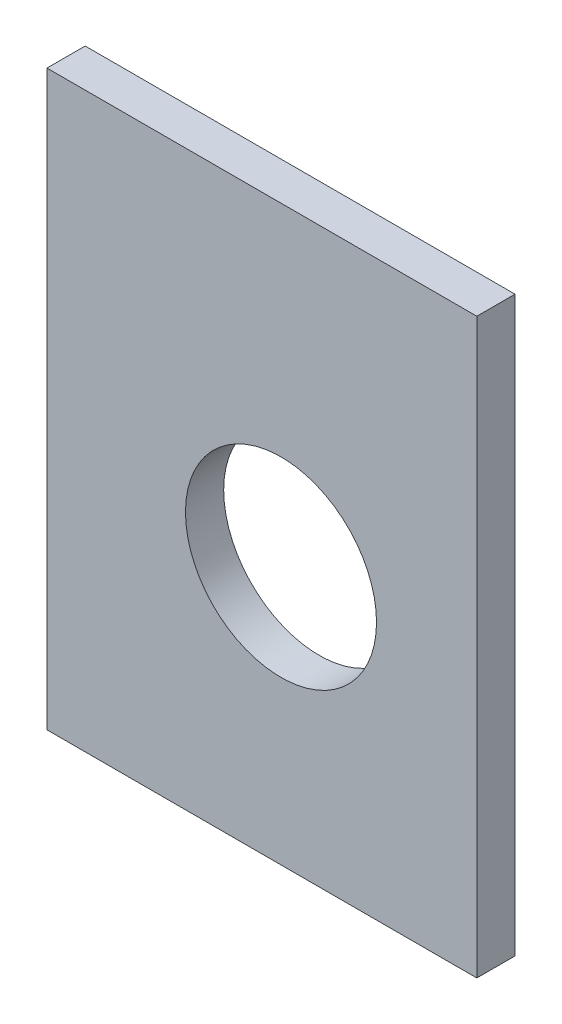
ISO-10303-21;
HEADER;
FILE_DESCRIPTION(('STEP AP214'),'2;1');
FILE_NAME('part.step','',(''),(''),'','','');
FILE_SCHEMA(('AUTOMOTIVE_DESIGN { 1 0 10303 214 1 1 1 1 }'));
ENDSEC;
DATA;
#1=APPLICATION_CONTEXT('core data for automotive mechanical design processes');
#2=APPLICATION_PROTOCOL_DEFINITION('international standard','automotive_design',2000,#1);
#3=PRODUCT_CONTEXT('',#1,'mechanical');
#4=PRODUCT('Part','Part','',(#3));
#5=PRODUCT_RELATED_PRODUCT_CATEGORY('part','',(#4));
#6=PRODUCT_DEFINITION_FORMATION('','',#4);
#7=PRODUCT_DEFINITION_CONTEXT('part definition',#1,'design');
#8=PRODUCT_DEFINITION('design','',#6,#7);
#9=PRODUCT_DEFINITION_SHAPE('','',#8);
#10=(LENGTH_UNIT() NAMED_UNIT(*) SI_UNIT(.MILLI.,.METRE.));
#11=(NAMED_UNIT(*) PLANE_ANGLE_UNIT() SI_UNIT($,.RADIAN.));
#12=(NAMED_UNIT(*) SI_UNIT($,.STERADIAN.) SOLID_ANGLE_UNIT());
#13=UNCERTAINTY_MEASURE_WITH_UNIT(LENGTH_MEASURE(1.E-05),#10,'distance_accuracy_value','');
#14=(GEOMETRIC_REPRESENTATION_CONTEXT(3) GLOBAL_UNCERTAINTY_ASSIGNED_CONTEXT((#13)) GLOBAL_UNIT_ASSIGNED_CONTEXT((#10,
#11,#12)) REPRESENTATION_CONTEXT('',''));
#15=CARTESIAN_POINT('',(0.,0.,0.));
#16=DIRECTION('',(0.,0.,1.));
#17=DIRECTION('',(1.,0.,0.));
#18=AXIS2_PLACEMENT_3D('',#15,#16,#17);
#19=CARTESIAN_POINT('',(0.,0.,4.));
#20=DIRECTION('',(0.,0.,-1.));
#21=DIRECTION('',(-1.,0.,0.));
#22=AXIS2_PLACEMENT_3D('',#19,#20,#21);
#23=PLANE('',#22);
#24=DIRECTION('',(0.,1.,0.));
#25=VECTOR('',#24,1.);
#26=CARTESIAN_POINT('',(22.5,-30.,4.));
#27=LINE('',#26,#25);
#28=CARTESIAN_POINT('',(22.5,-30.,4.));
#29=VERTEX_POINT('',#28);
#30=CARTESIAN_POINT('',(22.5,30.,4.));
#31=VERTEX_POINT('',#30);
#32=EDGE_CURVE('E84',#29,#31,#27,.T.);
#33=ORIENTED_EDGE('',*,*,#32,.T.);
#34=DIRECTION('',(-1.,0.,0.));
#35=VECTOR('',#34,1.);
#36=CARTESIAN_POINT('',(-22.5,30.,4.));
#37=LINE('',#36,#35);
#38=CARTESIAN_POINT('',(-22.5,30.,4.));
#39=VERTEX_POINT('',#38);
#40=EDGE_CURVE('E79',#31,#39,#37,.T.);
#41=ORIENTED_EDGE('',*,*,#40,.T.);
#42=DIRECTION('',(0.,-1.,0.));
#43=VECTOR('',#42,1.);
#44=CARTESIAN_POINT('',(-22.5,-30.,4.));
#45=LINE('',#44,#43);
#46=CARTESIAN_POINT('',(-22.5,-30.,4.));
#47=VERTEX_POINT('',#46);
#48=EDGE_CURVE('E82',#39,#47,#45,.T.);
#49=ORIENTED_EDGE('',*,*,#48,.T.);
#50=DIRECTION('',(1.,0.,0.));
#51=VECTOR('',#50,1.);
#52=CARTESIAN_POINT('',(-22.5,-30.,4.));
#53=LINE('',#52,#51);
#54=EDGE_CURVE('E49',#47,#29,#53,.T.);
#55=ORIENTED_EDGE('',*,*,#54,.T.);
#56=EDGE_LOOP('',(#33,#41,#49,#55));
#57=FACE_BOUND('',#56,.T.);
#58=CARTESIAN_POINT('',(2.,-3.,4.));
#59=DIRECTION('',(0.,0.,1.));
#60=DIRECTION('',(1.,0.,0.));
#61=AXIS2_PLACEMENT_3D('',#58,#59,#60);
#62=CIRCLE('',#61,10.);
#63=CARTESIAN_POINT('',(12.,-3.,4.));
#64=VERTEX_POINT('',#63);
#65=EDGE_CURVE('E99',#64,#64,#62,.T.);
#66=ORIENTED_EDGE('',*,*,#65,.F.);
#67=EDGE_LOOP('',(#66));
#68=FACE_BOUND('',#67,.T.);
#69=ADVANCED_FACE('F32',(#57,#68),#23,.F.);
#70=CARTESIAN_POINT('',(0.,0.,0.));
#71=DIRECTION('',(0.,0.,-1.));
#72=DIRECTION('',(-1.,0.,0.));
#73=AXIS2_PLACEMENT_3D('',#70,#71,#72);
#74=PLANE('',#73);
#75=DIRECTION('',(0.,1.,0.));
#76=VECTOR('',#75,1.);
#77=CARTESIAN_POINT('',(22.5,-30.,0.));
#78=LINE('',#77,#76);
#79=CARTESIAN_POINT('',(22.5,-30.,0.));
#80=VERTEX_POINT('',#79);
#81=CARTESIAN_POINT('',(22.5,30.,0.));
#82=VERTEX_POINT('',#81);
#83=EDGE_CURVE('E96',#80,#82,#78,.T.);
#84=ORIENTED_EDGE('',*,*,#83,.F.);
#85=DIRECTION('',(1.,0.,0.));
#86=VECTOR('',#85,1.);
#87=CARTESIAN_POINT('',(-22.5,-30.,0.));
#88=LINE('',#87,#86);
#89=CARTESIAN_POINT('',(-22.5,-30.,0.));
#90=VERTEX_POINT('',#89);
#91=EDGE_CURVE('E72',#90,#80,#88,.T.);
#92=ORIENTED_EDGE('',*,*,#91,.F.);
#93=DIRECTION('',(0.,-1.,0.));
#94=VECTOR('',#93,1.);
#95=CARTESIAN_POINT('',(-22.5,-30.,0.));
#96=LINE('',#95,#94);
#97=CARTESIAN_POINT('',(-22.5,30.,0.));
#98=VERTEX_POINT('',#97);
#99=EDGE_CURVE('E66',#98,#90,#96,.T.);
#100=ORIENTED_EDGE('',*,*,#99,.F.);
#101=DIRECTION('',(-1.,0.,0.));
#102=VECTOR('',#101,1.);
#103=CARTESIAN_POINT('',(-22.5,30.,0.));
#104=LINE('',#103,#102);
#105=EDGE_CURVE('E88',#82,#98,#104,.T.);
#106=ORIENTED_EDGE('',*,*,#105,.F.);
#107=EDGE_LOOP('',(#84,#92,#100,#106));
#108=FACE_BOUND('',#107,.T.);
#109=CARTESIAN_POINT('',(2.,-3.,0.));
#110=DIRECTION('',(0.,0.,1.));
#111=DIRECTION('',(1.,0.,0.));
#112=AXIS2_PLACEMENT_3D('',#109,#110,#111);
#113=CIRCLE('',#112,10.);
#114=CARTESIAN_POINT('',(12.,-3.,0.));
#115=VERTEX_POINT('',#114);
#116=EDGE_CURVE('E111',#115,#115,#113,.T.);
#117=ORIENTED_EDGE('',*,*,#116,.T.);
#118=EDGE_LOOP('',(#117));
#119=FACE_BOUND('',#118,.T.);
#120=ADVANCED_FACE('F107',(#108,#119),#74,.T.);
#121=CARTESIAN_POINT('',(22.5,-30.,4.));
#122=DIRECTION('',(-1.,0.,0.));
#123=DIRECTION('',(0.,0.,1.));
#124=AXIS2_PLACEMENT_3D('',#121,#122,#123);
#125=PLANE('',#124);
#126=ORIENTED_EDGE('',*,*,#83,.T.);
#127=DIRECTION('',(0.,0.,-1.));
#128=VECTOR('',#127,1.);
#129=CARTESIAN_POINT('',(22.5,30.,4.));
#130=LINE('',#129,#128);
#131=EDGE_CURVE('E11',#31,#82,#130,.T.);
#132=ORIENTED_EDGE('',*,*,#131,.F.);
#133=ORIENTED_EDGE('',*,*,#32,.F.);
#134=DIRECTION('',(0.,0.,-1.));
#135=VECTOR('',#134,1.);
#136=CARTESIAN_POINT('',(22.5,-30.,4.));
#137=LINE('',#136,#135);
#138=EDGE_CURVE('E92',#29,#80,#137,.T.);
#139=ORIENTED_EDGE('',*,*,#138,.T.);
#140=EDGE_LOOP('',(#126,#132,#133,#139));
#141=FACE_BOUND('',#140,.T.);
#142=ADVANCED_FACE('F34',(#141),#125,.F.);
#143=CARTESIAN_POINT('',(-22.5,30.,4.));
#144=DIRECTION('',(0.,-1.,0.));
#145=DIRECTION('',(0.,0.,-1.));
#146=AXIS2_PLACEMENT_3D('',#143,#144,#145);
#147=PLANE('',#146);
#148=ORIENTED_EDGE('',*,*,#105,.T.);
#149=DIRECTION('',(0.,0.,-1.));
#150=VECTOR('',#149,1.);
#151=CARTESIAN_POINT('',(-22.5,30.,4.));
#152=LINE('',#151,#150);
#153=EDGE_CURVE('E41',#39,#98,#152,.T.);
#154=ORIENTED_EDGE('',*,*,#153,.F.);
#155=ORIENTED_EDGE('',*,*,#40,.F.);
#156=ORIENTED_EDGE('',*,*,#131,.T.);
#157=EDGE_LOOP('',(#148,#154,#155,#156));
#158=FACE_BOUND('',#157,.T.);
#159=ADVANCED_FACE('F87',(#158),#147,.F.);
#160=CARTESIAN_POINT('',(-22.5,-30.,4.));
#161=DIRECTION('',(1.,0.,0.));
#162=DIRECTION('',(0.,0.,-1.));
#163=AXIS2_PLACEMENT_3D('',#160,#161,#162);
#164=PLANE('',#163);
#165=ORIENTED_EDGE('',*,*,#99,.T.);
#166=DIRECTION('',(0.,0.,-1.));
#167=VECTOR('',#166,1.);
#168=CARTESIAN_POINT('',(-22.5,-30.,4.));
#169=LINE('',#168,#167);
#170=EDGE_CURVE('E89',#47,#90,#169,.T.);
#171=ORIENTED_EDGE('',*,*,#170,.F.);
#172=ORIENTED_EDGE('',*,*,#48,.F.);
#173=ORIENTED_EDGE('',*,*,#153,.T.);
#174=EDGE_LOOP('',(#165,#171,#172,#173));
#175=FACE_BOUND('',#174,.T.);
#176=ADVANCED_FACE('F90',(#175),#164,.F.);
#177=CARTESIAN_POINT('',(-22.5,-30.,4.));
#178=DIRECTION('',(0.,1.,0.));
#179=DIRECTION('',(0.,0.,1.));
#180=AXIS2_PLACEMENT_3D('',#177,#178,#179);
#181=PLANE('',#180);
#182=ORIENTED_EDGE('',*,*,#91,.T.);
#183=ORIENTED_EDGE('',*,*,#138,.F.);
#184=ORIENTED_EDGE('',*,*,#54,.F.);
#185=ORIENTED_EDGE('',*,*,#170,.T.);
#186=EDGE_LOOP('',(#182,#183,#184,#185));
#187=FACE_BOUND('',#186,.T.);
#188=ADVANCED_FACE('F104',(#187),#181,.F.);
#189=CARTESIAN_POINT('',(2.,-3.,4.));
#190=DIRECTION('',(0.,0.,-1.));
#191=DIRECTION('',(-1.,0.,0.));
#192=AXIS2_PLACEMENT_3D('',#189,#190,#191);
#193=CYLINDRICAL_SURFACE('',#192,10.);
#194=ORIENTED_EDGE('',*,*,#65,.T.);
#195=EDGE_LOOP('',(#194));
#196=FACE_BOUND('',#195,.T.);
#197=ORIENTED_EDGE('',*,*,#116,.F.);
#198=EDGE_LOOP('',(#197));
#199=FACE_BOUND('',#198,.T.);
#200=ADVANCED_FACE('F117',(#196,#199),#193,.F.);
#201=CLOSED_SHELL('',(#69,#120,#142,#159,#176,#188,#200));
#202=MANIFOLD_SOLID_BREP('B2',#201);
#203=ADVANCED_BREP_SHAPE_REPRESENTATION('',(#18,#202),#14);
#204=SHAPE_DEFINITION_REPRESENTATION(#9,#203);
ENDSEC;
END-ISO-10303-21;
